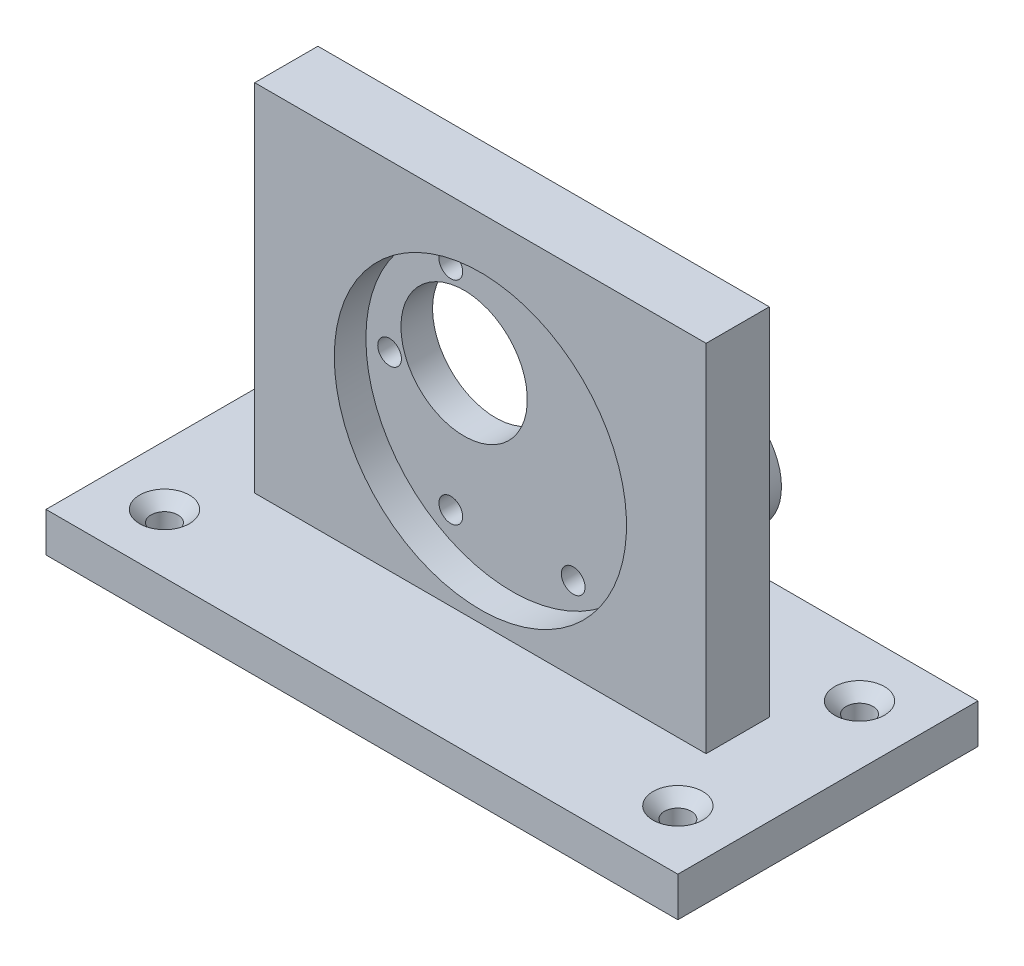
ISO-10303-21;
HEADER;
FILE_DESCRIPTION(('STEP AP214'),'2;1');
FILE_NAME('part.step','',(''),(''),'','','');
FILE_SCHEMA(('AUTOMOTIVE_DESIGN { 1 0 10303 214 1 1 1 1 }'));
ENDSEC;
DATA;
#1=APPLICATION_CONTEXT('core data for automotive mechanical design processes');
#2=APPLICATION_PROTOCOL_DEFINITION('international standard','automotive_design',2000,#1);
#3=PRODUCT_CONTEXT('',#1,'mechanical');
#4=PRODUCT('Part','Part','',(#3));
#5=PRODUCT_RELATED_PRODUCT_CATEGORY('part','',(#4));
#6=PRODUCT_DEFINITION_FORMATION('','',#4);
#7=PRODUCT_DEFINITION_CONTEXT('part definition',#1,'design');
#8=PRODUCT_DEFINITION('design','',#6,#7);
#9=PRODUCT_DEFINITION_SHAPE('','',#8);
#10=(LENGTH_UNIT() NAMED_UNIT(*) SI_UNIT(.MILLI.,.METRE.));
#11=(NAMED_UNIT(*) PLANE_ANGLE_UNIT() SI_UNIT($,.RADIAN.));
#12=(NAMED_UNIT(*) SI_UNIT($,.STERADIAN.) SOLID_ANGLE_UNIT());
#13=UNCERTAINTY_MEASURE_WITH_UNIT(LENGTH_MEASURE(1.E-05),#10,'distance_accuracy_value','');
#14=(GEOMETRIC_REPRESENTATION_CONTEXT(3) GLOBAL_UNCERTAINTY_ASSIGNED_CONTEXT((#13)) GLOBAL_UNIT_ASSIGNED_CONTEXT((#10,
#11,#12)) REPRESENTATION_CONTEXT('',''));
#15=CARTESIAN_POINT('',(0.,0.,0.));
#16=DIRECTION('',(0.,0.,1.));
#17=DIRECTION('',(1.,0.,0.));
#18=AXIS2_PLACEMENT_3D('',#15,#16,#17);
#19=CARTESIAN_POINT('',(40.,5.,23.));
#20=DIRECTION('',(0.,-1.,0.));
#21=DIRECTION('',(-1.,0.,0.));
#22=AXIS2_PLACEMENT_3D('',#19,#20,#21);
#23=PLANE('',#22);
#24=CARTESIAN_POINT('',(32.5,5.,-7.5));
#25=DIRECTION('',(0.,-1.,0.));
#26=DIRECTION('',(0.,0.,1.));
#27=AXIS2_PLACEMENT_3D('',#24,#25,#26);
#28=CIRCLE('',#27,3.15);
#29=CARTESIAN_POINT('',(32.5,5.,-4.35));
#30=VERTEX_POINT('',#29);
#31=EDGE_CURVE('E150',#30,#30,#28,.T.);
#32=ORIENTED_EDGE('',*,*,#31,.T.);
#33=EDGE_LOOP('',(#32));
#34=FACE_BOUND('',#33,.T.);
#35=CARTESIAN_POINT('',(-32.5,5.00000000000002,15.5));
#36=DIRECTION('',(0.,-1.,0.));
#37=DIRECTION('',(0.,0.,1.));
#38=AXIS2_PLACEMENT_3D('',#35,#36,#37);
#39=CIRCLE('',#38,3.15);
#40=CARTESIAN_POINT('',(-32.5,5.00000000000002,18.65));
#41=VERTEX_POINT('',#40);
#42=EDGE_CURVE('E160',#41,#41,#39,.T.);
#43=ORIENTED_EDGE('',*,*,#42,.T.);
#44=EDGE_LOOP('',(#43));
#45=FACE_BOUND('',#44,.T.);
#46=CARTESIAN_POINT('',(-32.5,5.00000000000002,-7.5));
#47=DIRECTION('',(0.,-1.,0.));
#48=DIRECTION('',(0.,0.,1.));
#49=AXIS2_PLACEMENT_3D('',#46,#47,#48);
#50=CIRCLE('',#49,3.15);
#51=CARTESIAN_POINT('',(-32.5,5.00000000000002,-4.35));
#52=VERTEX_POINT('',#51);
#53=EDGE_CURVE('E172',#52,#52,#50,.T.);
#54=ORIENTED_EDGE('',*,*,#53,.T.);
#55=EDGE_LOOP('',(#54));
#56=FACE_BOUND('',#55,.T.);
#57=DIRECTION('',(0.,0.,-1.));
#58=VECTOR('',#57,1.);
#59=CARTESIAN_POINT('',(-40.,5.00000000000002,23.));
#60=LINE('',#59,#58);
#61=CARTESIAN_POINT('',(-40.,5.00000000000002,23.));
#62=VERTEX_POINT('',#61);
#63=CARTESIAN_POINT('',(-40.,5.00000000000002,-15.));
#64=VERTEX_POINT('',#63);
#65=EDGE_CURVE('E216',#62,#64,#60,.T.);
#66=ORIENTED_EDGE('',*,*,#65,.F.);
#67=DIRECTION('',(1.,0.,0.));
#68=VECTOR('',#67,1.);
#69=CARTESIAN_POINT('',(40.,5.,23.));
#70=LINE('',#69,#68);
#71=CARTESIAN_POINT('',(40.,5.,23.));
#72=VERTEX_POINT('',#71);
#73=EDGE_CURVE('E208',#62,#72,#70,.T.);
#74=ORIENTED_EDGE('',*,*,#73,.T.);
#75=DIRECTION('',(0.,0.,-1.));
#76=VECTOR('',#75,1.);
#77=CARTESIAN_POINT('',(40.,5.,23.));
#78=LINE('',#77,#76);
#79=CARTESIAN_POINT('',(40.,5.,-15.));
#80=VERTEX_POINT('',#79);
#81=EDGE_CURVE('E212',#72,#80,#78,.T.);
#82=ORIENTED_EDGE('',*,*,#81,.T.);
#83=DIRECTION('',(1.,0.,0.));
#84=VECTOR('',#83,1.);
#85=CARTESIAN_POINT('',(40.,5.,-15.));
#86=LINE('',#85,#84);
#87=EDGE_CURVE('E194',#64,#80,#86,.T.);
#88=ORIENTED_EDGE('',*,*,#87,.F.);
#89=EDGE_LOOP('',(#66,#74,#82,#88));
#90=FACE_BOUND('',#89,.T.);
#91=DIRECTION('',(0.,0.,-1.));
#92=VECTOR('',#91,1.);
#93=CARTESIAN_POINT('',(-28.575,5.00000000000001,8.));
#94=LINE('',#93,#92);
#95=CARTESIAN_POINT('',(-28.575,5.00000000000001,8.));
#96=VERTEX_POINT('',#95);
#97=CARTESIAN_POINT('',(-28.575,5.00000000000001,0.));
#98=VERTEX_POINT('',#97);
#99=EDGE_CURVE('E228',#96,#98,#94,.T.);
#100=ORIENTED_EDGE('',*,*,#99,.T.);
#101=DIRECTION('',(1.,0.,0.));
#102=VECTOR('',#101,1.);
#103=CARTESIAN_POINT('',(0.,5.00000000000001,0.));
#104=LINE('',#103,#102);
#105=CARTESIAN_POINT('',(28.575,5.,0.));
#106=VERTEX_POINT('',#105);
#107=EDGE_CURVE('E54',#98,#106,#104,.T.);
#108=ORIENTED_EDGE('',*,*,#107,.T.);
#109=DIRECTION('',(0.,0.,-1.));
#110=VECTOR('',#109,1.);
#111=CARTESIAN_POINT('',(28.575,5.,8.));
#112=LINE('',#111,#110);
#113=CARTESIAN_POINT('',(28.575,5.,8.));
#114=VERTEX_POINT('',#113);
#115=EDGE_CURVE('E232',#114,#106,#112,.T.);
#116=ORIENTED_EDGE('',*,*,#115,.F.);
#117=DIRECTION('',(1.,0.,0.));
#118=VECTOR('',#117,1.);
#119=CARTESIAN_POINT('',(0.,5.00000000000001,8.));
#120=LINE('',#119,#118);
#121=EDGE_CURVE('E236',#96,#114,#120,.T.);
#122=ORIENTED_EDGE('',*,*,#121,.F.);
#123=EDGE_LOOP('',(#100,#108,#116,#122));
#124=FACE_BOUND('',#123,.T.);
#125=CARTESIAN_POINT('',(32.5,5.,15.5));
#126=DIRECTION('',(0.,-1.,0.));
#127=DIRECTION('',(0.,0.,1.));
#128=AXIS2_PLACEMENT_3D('',#125,#126,#127);
#129=CIRCLE('',#128,3.15);
#130=CARTESIAN_POINT('',(32.5,5.,18.65));
#131=VERTEX_POINT('',#130);
#132=EDGE_CURVE('E141',#131,#131,#129,.T.);
#133=ORIENTED_EDGE('',*,*,#132,.T.);
#134=EDGE_LOOP('',(#133));
#135=FACE_BOUND('',#134,.T.);
#136=ADVANCED_FACE('F45',(#34,#45,#56,#90,#124,#135),#23,.F.);
#137=CARTESIAN_POINT('',(28.575,50.,8.));
#138=DIRECTION('',(-1.,0.,0.));
#139=DIRECTION('',(0.,1.,0.));
#140=AXIS2_PLACEMENT_3D('',#137,#138,#139);
#141=PLANE('',#140);
#142=ORIENTED_EDGE('',*,*,#115,.T.);
#143=DIRECTION('',(0.,-1.,0.));
#144=VECTOR('',#143,1.);
#145=CARTESIAN_POINT('',(28.575,50.,0.));
#146=LINE('',#145,#144);
#147=CARTESIAN_POINT('',(28.575,50.,0.));
#148=VERTEX_POINT('',#147);
#149=EDGE_CURVE('E298',#148,#106,#146,.T.);
#150=ORIENTED_EDGE('',*,*,#149,.F.);
#151=DIRECTION('',(0.,0.,-1.));
#152=VECTOR('',#151,1.);
#153=CARTESIAN_POINT('',(28.575,50.,8.));
#154=LINE('',#153,#152);
#155=CARTESIAN_POINT('',(28.575,50.,8.));
#156=VERTEX_POINT('',#155);
#157=EDGE_CURVE('E312',#156,#148,#154,.T.);
#158=ORIENTED_EDGE('',*,*,#157,.F.);
#159=DIRECTION('',(0.,-1.,0.));
#160=VECTOR('',#159,1.);
#161=CARTESIAN_POINT('',(28.575,50.,8.));
#162=LINE('',#161,#160);
#163=EDGE_CURVE('E301',#156,#114,#162,.T.);
#164=ORIENTED_EDGE('',*,*,#163,.T.);
#165=EDGE_LOOP('',(#142,#150,#158,#164));
#166=FACE_BOUND('',#165,.T.);
#167=ADVANCED_FACE('F335',(#166),#141,.F.);
#168=CARTESIAN_POINT('',(-28.575,50.,8.));
#169=DIRECTION('',(-1.,0.,0.));
#170=DIRECTION('',(0.,1.,0.));
#171=AXIS2_PLACEMENT_3D('',#168,#169,#170);
#172=PLANE('',#171);
#173=DIRECTION('',(0.,-1.,0.));
#174=VECTOR('',#173,1.);
#175=CARTESIAN_POINT('',(-28.575,50.,8.));
#176=LINE('',#175,#174);
#177=CARTESIAN_POINT('',(-28.575,50.,8.));
#178=VERTEX_POINT('',#177);
#179=EDGE_CURVE('E297',#178,#96,#176,.T.);
#180=ORIENTED_EDGE('',*,*,#179,.F.);
#181=DIRECTION('',(0.,0.,-1.));
#182=VECTOR('',#181,1.);
#183=CARTESIAN_POINT('',(-28.575,50.,8.));
#184=LINE('',#183,#182);
#185=CARTESIAN_POINT('',(-28.575,50.,0.));
#186=VERTEX_POINT('',#185);
#187=EDGE_CURVE('E304',#178,#186,#184,.T.);
#188=ORIENTED_EDGE('',*,*,#187,.T.);
#189=DIRECTION('',(0.,-1.,0.));
#190=VECTOR('',#189,1.);
#191=CARTESIAN_POINT('',(-28.575,50.,0.));
#192=LINE('',#191,#190);
#193=EDGE_CURVE('E307',#186,#98,#192,.T.);
#194=ORIENTED_EDGE('',*,*,#193,.T.);
#195=ORIENTED_EDGE('',*,*,#99,.F.);
#196=EDGE_LOOP('',(#180,#188,#194,#195));
#197=FACE_BOUND('',#196,.T.);
#198=ADVANCED_FACE('F341',(#197),#172,.T.);
#199=CARTESIAN_POINT('',(0.,0.,8.));
#200=DIRECTION('',(0.,0.,-1.));
#201=DIRECTION('',(1.,0.,0.));
#202=AXIS2_PLACEMENT_3D('',#199,#200,#201);
#203=PLANE('',#202);
#204=CARTESIAN_POINT('',(0.,25.,8.));
#205=DIRECTION('',(0.,0.,-1.));
#206=DIRECTION('',(-1.,0.,0.));
#207=AXIS2_PLACEMENT_3D('',#204,#205,#206);
#208=CIRCLE('',#207,18.5);
#209=CARTESIAN_POINT('',(-18.5,25.,8.));
#210=VERTEX_POINT('',#209);
#211=EDGE_CURVE('E240',#210,#210,#208,.T.);
#212=ORIENTED_EDGE('',*,*,#211,.T.);
#213=EDGE_LOOP('',(#212));
#214=FACE_BOUND('',#213,.T.);
#215=ORIENTED_EDGE('',*,*,#121,.T.);
#216=ORIENTED_EDGE('',*,*,#163,.F.);
#217=DIRECTION('',(-1.,0.,0.));
#218=VECTOR('',#217,1.);
#219=CARTESIAN_POINT('',(28.575,50.,8.));
#220=LINE('',#219,#218);
#221=EDGE_CURVE('E294',#156,#178,#220,.T.);
#222=ORIENTED_EDGE('',*,*,#221,.T.);
#223=ORIENTED_EDGE('',*,*,#179,.T.);
#224=EDGE_LOOP('',(#215,#216,#222,#223));
#225=FACE_BOUND('',#224,.T.);
#226=ADVANCED_FACE('F338',(#214,#225),#203,.F.);
#227=CARTESIAN_POINT('',(0.,0.,0.));
#228=DIRECTION('',(0.,0.,-1.));
#229=DIRECTION('',(1.,0.,0.));
#230=AXIS2_PLACEMENT_3D('',#227,#228,#229);
#231=PLANE('',#230);
#232=CARTESIAN_POINT('',(20.3378221746704,28.4999999993294,0.));
#233=DIRECTION('',(0.,0.,1.));
#234=DIRECTION('',(1.,0.,0.));
#235=AXIS2_PLACEMENT_3D('',#232,#233,#234);
#236=CIRCLE('',#235,7.239);
#237=CARTESIAN_POINT('',(27.5768221746704,28.4999999993294,0.));
#238=VERTEX_POINT('',#237);
#239=EDGE_CURVE('E737',#238,#238,#236,.T.);
#240=ORIENTED_EDGE('',*,*,#239,.T.);
#241=EDGE_LOOP('',(#240));
#242=FACE_BOUND('',#241,.T.);
#243=CARTESIAN_POINT('',(7.74999999999999,38.4233937586588,0.));
#244=DIRECTION('',(0.,0.,-1.));
#245=DIRECTION('',(-1.,0.,0.));
#246=AXIS2_PLACEMENT_3D('',#243,#244,#245);
#247=CIRCLE('',#246,1.50000000039213);
#248=CARTESIAN_POINT('',(6.24999999960786,38.4233937586588,0.));
#249=VERTEX_POINT('',#248);
#250=EDGE_CURVE('E274',#249,#249,#247,.T.);
#251=ORIENTED_EDGE('',*,*,#250,.F.);
#252=EDGE_LOOP('',(#251));
#253=FACE_BOUND('',#252,.T.);
#254=CARTESIAN_POINT('',(7.74999999999999,11.5766062413412,0.));
#255=DIRECTION('',(0.,0.,-1.));
#256=DIRECTION('',(-1.,0.,0.));
#257=AXIS2_PLACEMENT_3D('',#254,#255,#256);
#258=CIRCLE('',#257,1.50000000039213);
#259=CARTESIAN_POINT('',(6.24999999960786,11.5766062413412,0.));
#260=VERTEX_POINT('',#259);
#261=EDGE_CURVE('E279',#260,#260,#258,.T.);
#262=ORIENTED_EDGE('',*,*,#261,.F.);
#263=EDGE_LOOP('',(#262));
#264=FACE_BOUND('',#263,.T.);
#265=CARTESIAN_POINT('',(-7.75000000000001,11.5766062413412,0.));
#266=DIRECTION('',(0.,0.,-1.));
#267=DIRECTION('',(-1.,0.,0.));
#268=AXIS2_PLACEMENT_3D('',#265,#266,#267);
#269=CIRCLE('',#268,1.50000000039213);
#270=CARTESIAN_POINT('',(-9.25000000039214,11.5766062413412,0.));
#271=VERTEX_POINT('',#270);
#272=EDGE_CURVE('E283',#271,#271,#269,.T.);
#273=ORIENTED_EDGE('',*,*,#272,.F.);
#274=EDGE_LOOP('',(#273));
#275=FACE_BOUND('',#274,.T.);
#276=CARTESIAN_POINT('',(-15.5,25.,0.));
#277=DIRECTION('',(0.,0.,-1.));
#278=DIRECTION('',(-1.,0.,0.));
#279=AXIS2_PLACEMENT_3D('',#276,#277,#278);
#280=CIRCLE('',#279,1.50000000039213);
#281=CARTESIAN_POINT('',(-17.0000000003921,25.,0.));
#282=VERTEX_POINT('',#281);
#283=EDGE_CURVE('E273',#282,#282,#280,.T.);
#284=ORIENTED_EDGE('',*,*,#283,.F.);
#285=EDGE_LOOP('',(#284));
#286=FACE_BOUND('',#285,.T.);
#287=CARTESIAN_POINT('',(-6.06217782532956,28.4999999993294,0.));
#288=DIRECTION('',(0.,0.,-1.));
#289=DIRECTION('',(-1.,0.,0.));
#290=AXIS2_PLACEMENT_3D('',#287,#288,#289);
#291=CIRCLE('',#290,8.00000000000001);
#292=CARTESIAN_POINT('',(-14.0621778253296,28.4999999993294,0.));
#293=VERTEX_POINT('',#292);
#294=EDGE_CURVE('E269',#293,#293,#291,.T.);
#295=ORIENTED_EDGE('',*,*,#294,.F.);
#296=EDGE_LOOP('',(#295));
#297=FACE_BOUND('',#296,.T.);
#298=CARTESIAN_POINT('',(-7.74999999999999,38.4233937586588,0.));
#299=DIRECTION('',(0.,0.,-1.));
#300=DIRECTION('',(-1.,0.,0.));
#301=AXIS2_PLACEMENT_3D('',#298,#299,#300);
#302=CIRCLE('',#301,1.50000000039214);
#303=CARTESIAN_POINT('',(-9.25000000039213,38.4233937586588,0.));
#304=VERTEX_POINT('',#303);
#305=EDGE_CURVE('E278',#304,#304,#302,.T.);
#306=ORIENTED_EDGE('',*,*,#305,.F.);
#307=EDGE_LOOP('',(#306));
#308=FACE_BOUND('',#307,.T.);
#309=ORIENTED_EDGE('',*,*,#193,.F.);
#310=DIRECTION('',(-1.,0.,0.));
#311=VECTOR('',#310,1.);
#312=CARTESIAN_POINT('',(28.575,50.,0.));
#313=LINE('',#312,#311);
#314=EDGE_CURVE('E293',#148,#186,#313,.T.);
#315=ORIENTED_EDGE('',*,*,#314,.F.);
#316=ORIENTED_EDGE('',*,*,#149,.T.);
#317=ORIENTED_EDGE('',*,*,#107,.F.);
#318=EDGE_LOOP('',(#309,#315,#316,#317));
#319=FACE_BOUND('',#318,.T.);
#320=ADVANCED_FACE('F331',(#242,#253,#264,#275,#286,#297,#308,#319),#231,.T.);
#321=CARTESIAN_POINT('',(-7.74999999999999,38.4233937586588,10.));
#322=DIRECTION('',(0.,0.,-1.));
#323=DIRECTION('',(1.,0.,0.));
#324=AXIS2_PLACEMENT_3D('',#321,#322,#323);
#325=CYLINDRICAL_SURFACE('',#324,1.50000000039214);
#326=ORIENTED_EDGE('',*,*,#305,.T.);
#327=EDGE_LOOP('',(#326));
#328=FACE_BOUND('',#327,.T.);
#329=CARTESIAN_POINT('',(-7.74999999999999,38.4233937586588,4.));
#330=DIRECTION('',(0.,0.,-1.));
#331=DIRECTION('',(-1.,0.,0.));
#332=AXIS2_PLACEMENT_3D('',#329,#330,#331);
#333=CIRCLE('',#332,1.50000000039214);
#334=CARTESIAN_POINT('',(-9.25000000039213,38.4233937586588,4.));
#335=VERTEX_POINT('',#334);
#336=EDGE_CURVE('E265',#335,#335,#333,.T.);
#337=ORIENTED_EDGE('',*,*,#336,.F.);
#338=EDGE_LOOP('',(#337));
#339=FACE_BOUND('',#338,.T.);
#340=ADVANCED_FACE('F384',(#328,#339),#325,.F.);
#341=CARTESIAN_POINT('',(-6.06217782532956,28.4999999993294,10.));
#342=DIRECTION('',(0.,0.,-1.));
#343=DIRECTION('',(1.,0.,0.));
#344=AXIS2_PLACEMENT_3D('',#341,#342,#343);
#345=CYLINDRICAL_SURFACE('',#344,8.00000000000001);
#346=ORIENTED_EDGE('',*,*,#294,.T.);
#347=EDGE_LOOP('',(#346));
#348=FACE_BOUND('',#347,.T.);
#349=CARTESIAN_POINT('',(-6.06217782532956,28.4999999993294,4.));
#350=DIRECTION('',(0.,0.,-1.));
#351=DIRECTION('',(-1.,0.,0.));
#352=AXIS2_PLACEMENT_3D('',#349,#350,#351);
#353=CIRCLE('',#352,8.00000000000001);
#354=CARTESIAN_POINT('',(-14.0621778253296,28.4999999993294,4.));
#355=VERTEX_POINT('',#354);
#356=EDGE_CURVE('E261',#355,#355,#353,.T.);
#357=ORIENTED_EDGE('',*,*,#356,.F.);
#358=EDGE_LOOP('',(#357));
#359=FACE_BOUND('',#358,.T.);
#360=ADVANCED_FACE('F381',(#348,#359),#345,.F.);
#361=CARTESIAN_POINT('',(-15.5,25.,10.));
#362=DIRECTION('',(0.,0.,-1.));
#363=DIRECTION('',(1.,0.,0.));
#364=AXIS2_PLACEMENT_3D('',#361,#362,#363);
#365=CYLINDRICAL_SURFACE('',#364,1.50000000039213);
#366=ORIENTED_EDGE('',*,*,#283,.T.);
#367=EDGE_LOOP('',(#366));
#368=FACE_BOUND('',#367,.T.);
#369=CARTESIAN_POINT('',(-15.5,25.,4.));
#370=DIRECTION('',(0.,0.,-1.));
#371=DIRECTION('',(-1.,0.,0.));
#372=AXIS2_PLACEMENT_3D('',#369,#370,#371);
#373=CIRCLE('',#372,1.50000000039213);
#374=CARTESIAN_POINT('',(-17.0000000003921,25.,4.));
#375=VERTEX_POINT('',#374);
#376=EDGE_CURVE('E257',#375,#375,#373,.T.);
#377=ORIENTED_EDGE('',*,*,#376,.F.);
#378=EDGE_LOOP('',(#377));
#379=FACE_BOUND('',#378,.T.);
#380=ADVANCED_FACE('F383',(#368,#379),#365,.F.);
#381=CARTESIAN_POINT('',(-7.75000000000001,11.5766062413412,10.));
#382=DIRECTION('',(0.,0.,-1.));
#383=DIRECTION('',(1.,0.,0.));
#384=AXIS2_PLACEMENT_3D('',#381,#382,#383);
#385=CYLINDRICAL_SURFACE('',#384,1.50000000039213);
#386=ORIENTED_EDGE('',*,*,#272,.T.);
#387=EDGE_LOOP('',(#386));
#388=FACE_BOUND('',#387,.T.);
#389=CARTESIAN_POINT('',(-7.75000000000001,11.5766062413412,4.));
#390=DIRECTION('',(0.,0.,-1.));
#391=DIRECTION('',(-1.,0.,0.));
#392=AXIS2_PLACEMENT_3D('',#389,#390,#391);
#393=CIRCLE('',#392,1.50000000039213);
#394=CARTESIAN_POINT('',(-9.25000000039214,11.5766062413412,4.));
#395=VERTEX_POINT('',#394);
#396=EDGE_CURVE('E253',#395,#395,#393,.T.);
#397=ORIENTED_EDGE('',*,*,#396,.F.);
#398=EDGE_LOOP('',(#397));
#399=FACE_BOUND('',#398,.T.);
#400=ADVANCED_FACE('F389',(#388,#399),#385,.F.);
#401=CARTESIAN_POINT('',(7.74999999999999,11.5766062413412,10.));
#402=DIRECTION('',(0.,0.,-1.));
#403=DIRECTION('',(1.,0.,0.));
#404=AXIS2_PLACEMENT_3D('',#401,#402,#403);
#405=CYLINDRICAL_SURFACE('',#404,1.50000000039213);
#406=ORIENTED_EDGE('',*,*,#261,.T.);
#407=EDGE_LOOP('',(#406));
#408=FACE_BOUND('',#407,.T.);
#409=CARTESIAN_POINT('',(7.74999999999999,11.5766062413412,4.));
#410=DIRECTION('',(0.,0.,-1.));
#411=DIRECTION('',(-1.,0.,0.));
#412=AXIS2_PLACEMENT_3D('',#409,#410,#411);
#413=CIRCLE('',#412,1.50000000039213);
#414=CARTESIAN_POINT('',(6.24999999960786,11.5766062413412,4.));
#415=VERTEX_POINT('',#414);
#416=EDGE_CURVE('E249',#415,#415,#413,.T.);
#417=ORIENTED_EDGE('',*,*,#416,.F.);
#418=EDGE_LOOP('',(#417));
#419=FACE_BOUND('',#418,.T.);
#420=ADVANCED_FACE('F354',(#408,#419),#405,.F.);
#421=CARTESIAN_POINT('',(7.74999999999999,38.4233937586588,10.));
#422=DIRECTION('',(0.,0.,-1.));
#423=DIRECTION('',(1.,0.,0.));
#424=AXIS2_PLACEMENT_3D('',#421,#422,#423);
#425=CYLINDRICAL_SURFACE('',#424,1.50000000039213);
#426=ORIENTED_EDGE('',*,*,#250,.T.);
#427=EDGE_LOOP('',(#426));
#428=FACE_BOUND('',#427,.T.);
#429=CARTESIAN_POINT('',(7.74999999999999,38.4233937586588,4.));
#430=DIRECTION('',(0.,0.,-1.));
#431=DIRECTION('',(-1.,0.,0.));
#432=AXIS2_PLACEMENT_3D('',#429,#430,#431);
#433=CIRCLE('',#432,1.50000000039213);
#434=CARTESIAN_POINT('',(6.24999999960786,38.4233937586588,4.));
#435=VERTEX_POINT('',#434);
#436=EDGE_CURVE('E245',#435,#435,#433,.T.);
#437=ORIENTED_EDGE('',*,*,#436,.F.);
#438=EDGE_LOOP('',(#437));
#439=FACE_BOUND('',#438,.T.);
#440=ADVANCED_FACE('F346',(#428,#439),#425,.F.);
#441=CARTESIAN_POINT('',(28.575,50.,8.));
#442=DIRECTION('',(0.,1.,0.));
#443=DIRECTION('',(1.,0.,0.));
#444=AXIS2_PLACEMENT_3D('',#441,#442,#443);
#445=PLANE('',#444);
#446=ORIENTED_EDGE('',*,*,#314,.T.);
#447=ORIENTED_EDGE('',*,*,#187,.F.);
#448=ORIENTED_EDGE('',*,*,#221,.F.);
#449=ORIENTED_EDGE('',*,*,#157,.T.);
#450=EDGE_LOOP('',(#446,#447,#448,#449));
#451=FACE_BOUND('',#450,.T.);
#452=ADVANCED_FACE('F47',(#451),#445,.T.);
#453=CARTESIAN_POINT('',(0.,25.,4.));
#454=DIRECTION('',(0.,0.,1.));
#455=DIRECTION('',(-1.,0.,0.));
#456=AXIS2_PLACEMENT_3D('',#453,#454,#455);
#457=CYLINDRICAL_SURFACE('',#456,18.5);
#458=CARTESIAN_POINT('',(0.,25.,4.));
#459=DIRECTION('',(0.,0.,-1.));
#460=DIRECTION('',(-1.,0.,0.));
#461=AXIS2_PLACEMENT_3D('',#458,#459,#460);
#462=CIRCLE('',#461,18.5);
#463=CARTESIAN_POINT('',(-18.5,25.,4.));
#464=VERTEX_POINT('',#463);
#465=EDGE_CURVE('E241',#464,#464,#462,.T.);
#466=ORIENTED_EDGE('',*,*,#465,.T.);
#467=EDGE_LOOP('',(#466));
#468=FACE_BOUND('',#467,.T.);
#469=ORIENTED_EDGE('',*,*,#211,.F.);
#470=EDGE_LOOP('',(#469));
#471=FACE_BOUND('',#470,.T.);
#472=ADVANCED_FACE('F345',(#468,#471),#457,.F.);
#473=CARTESIAN_POINT('',(0.,25.,4.));
#474=DIRECTION('',(0.,0.,1.));
#475=DIRECTION('',(-1.,0.,0.));
#476=AXIS2_PLACEMENT_3D('',#473,#474,#475);
#477=PLANE('',#476);
#478=ORIENTED_EDGE('',*,*,#336,.T.);
#479=EDGE_LOOP('',(#478));
#480=FACE_BOUND('',#479,.T.);
#481=ORIENTED_EDGE('',*,*,#356,.T.);
#482=EDGE_LOOP('',(#481));
#483=FACE_BOUND('',#482,.T.);
#484=ORIENTED_EDGE('',*,*,#376,.T.);
#485=EDGE_LOOP('',(#484));
#486=FACE_BOUND('',#485,.T.);
#487=ORIENTED_EDGE('',*,*,#396,.T.);
#488=EDGE_LOOP('',(#487));
#489=FACE_BOUND('',#488,.T.);
#490=ORIENTED_EDGE('',*,*,#416,.T.);
#491=EDGE_LOOP('',(#490));
#492=FACE_BOUND('',#491,.T.);
#493=ORIENTED_EDGE('',*,*,#436,.T.);
#494=EDGE_LOOP('',(#493));
#495=FACE_BOUND('',#494,.T.);
#496=ORIENTED_EDGE('',*,*,#465,.F.);
#497=EDGE_LOOP('',(#496));
#498=FACE_BOUND('',#497,.T.);
#499=ADVANCED_FACE('F351',(#480,#483,#486,#489,#492,#495,#498),#477,.T.);
#500=CARTESIAN_POINT('',(40.,5.,23.));
#501=DIRECTION('',(-1.,0.,0.));
#502=DIRECTION('',(0.,0.,-1.));
#503=AXIS2_PLACEMENT_3D('',#500,#501,#502);
#504=PLANE('',#503);
#505=ORIENTED_EDGE('',*,*,#81,.F.);
#506=DIRECTION('',(0.,-1.,0.));
#507=VECTOR('',#506,1.);
#508=CARTESIAN_POINT('',(40.,5.,23.));
#509=LINE('',#508,#507);
#510=CARTESIAN_POINT('',(40.,0.,23.));
#511=VERTEX_POINT('',#510);
#512=EDGE_CURVE('E198',#72,#511,#509,.T.);
#513=ORIENTED_EDGE('',*,*,#512,.T.);
#514=DIRECTION('',(0.,0.,-1.));
#515=VECTOR('',#514,1.);
#516=CARTESIAN_POINT('',(40.,0.,23.));
#517=LINE('',#516,#515);
#518=CARTESIAN_POINT('',(40.,0.,-15.));
#519=VERTEX_POINT('',#518);
#520=EDGE_CURVE('E224',#511,#519,#517,.T.);
#521=ORIENTED_EDGE('',*,*,#520,.T.);
#522=DIRECTION('',(0.,-1.,0.));
#523=VECTOR('',#522,1.);
#524=CARTESIAN_POINT('',(40.,5.,-15.));
#525=LINE('',#524,#523);
#526=EDGE_CURVE('E184',#80,#519,#525,.T.);
#527=ORIENTED_EDGE('',*,*,#526,.F.);
#528=EDGE_LOOP('',(#505,#513,#521,#527));
#529=FACE_BOUND('',#528,.T.);
#530=ADVANCED_FACE('F373',(#529),#504,.F.);
#531=CARTESIAN_POINT('',(-40.,5.00000000000002,23.));
#532=DIRECTION('',(1.,0.,0.));
#533=DIRECTION('',(0.,0.,1.));
#534=AXIS2_PLACEMENT_3D('',#531,#532,#533);
#535=PLANE('',#534);
#536=DIRECTION('',(0.,0.,-1.));
#537=VECTOR('',#536,1.);
#538=CARTESIAN_POINT('',(-40.,0.,23.));
#539=LINE('',#538,#537);
#540=CARTESIAN_POINT('',(-40.,0.,23.));
#541=VERTEX_POINT('',#540);
#542=CARTESIAN_POINT('',(-40.,0.,-15.));
#543=VERTEX_POINT('',#542);
#544=EDGE_CURVE('E220',#541,#543,#539,.T.);
#545=ORIENTED_EDGE('',*,*,#544,.F.);
#546=DIRECTION('',(0.,1.,0.));
#547=VECTOR('',#546,1.);
#548=CARTESIAN_POINT('',(-40.,5.00000000000002,23.));
#549=LINE('',#548,#547);
#550=EDGE_CURVE('E205',#541,#62,#549,.T.);
#551=ORIENTED_EDGE('',*,*,#550,.T.);
#552=ORIENTED_EDGE('',*,*,#65,.T.);
#553=DIRECTION('',(0.,1.,0.));
#554=VECTOR('',#553,1.);
#555=CARTESIAN_POINT('',(-40.,5.00000000000002,-15.));
#556=LINE('',#555,#554);
#557=EDGE_CURVE('E191',#543,#64,#556,.T.);
#558=ORIENTED_EDGE('',*,*,#557,.F.);
#559=EDGE_LOOP('',(#545,#551,#552,#558));
#560=FACE_BOUND('',#559,.T.);
#561=ADVANCED_FACE('F370',(#560),#535,.F.);
#562=CARTESIAN_POINT('',(0.,0.,23.));
#563=DIRECTION('',(0.,0.,1.));
#564=DIRECTION('',(-1.,0.,0.));
#565=AXIS2_PLACEMENT_3D('',#562,#563,#564);
#566=PLANE('',#565);
#567=ORIENTED_EDGE('',*,*,#512,.F.);
#568=ORIENTED_EDGE('',*,*,#73,.F.);
#569=ORIENTED_EDGE('',*,*,#550,.F.);
#570=DIRECTION('',(-1.,0.,0.));
#571=VECTOR('',#570,1.);
#572=CARTESIAN_POINT('',(40.,0.,23.));
#573=LINE('',#572,#571);
#574=EDGE_CURVE('E202',#511,#541,#573,.T.);
#575=ORIENTED_EDGE('',*,*,#574,.F.);
#576=EDGE_LOOP('',(#567,#568,#569,#575));
#577=FACE_BOUND('',#576,.T.);
#578=ADVANCED_FACE('F368',(#577),#566,.T.);
#579=CARTESIAN_POINT('',(0.,0.,-15.));
#580=DIRECTION('',(0.,0.,1.));
#581=DIRECTION('',(-1.,0.,0.));
#582=AXIS2_PLACEMENT_3D('',#579,#580,#581);
#583=PLANE('',#582);
#584=ORIENTED_EDGE('',*,*,#526,.T.);
#585=DIRECTION('',(-1.,0.,0.));
#586=VECTOR('',#585,1.);
#587=CARTESIAN_POINT('',(40.,0.,-15.));
#588=LINE('',#587,#586);
#589=EDGE_CURVE('E188',#519,#543,#588,.T.);
#590=ORIENTED_EDGE('',*,*,#589,.T.);
#591=ORIENTED_EDGE('',*,*,#557,.T.);
#592=ORIENTED_EDGE('',*,*,#87,.T.);
#593=EDGE_LOOP('',(#584,#590,#591,#592));
#594=FACE_BOUND('',#593,.T.);
#595=ADVANCED_FACE('F408',(#594),#583,.F.);
#596=CARTESIAN_POINT('',(28.575,0.,8.));
#597=DIRECTION('',(0.,1.,0.));
#598=DIRECTION('',(1.,0.,0.));
#599=AXIS2_PLACEMENT_3D('',#596,#597,#598);
#600=PLANE('',#599);
#601=CARTESIAN_POINT('',(32.5,0.,-7.5));
#602=DIRECTION('',(0.,-1.,0.));
#603=DIRECTION('',(0.,0.,1.));
#604=AXIS2_PLACEMENT_3D('',#601,#602,#603);
#605=CIRCLE('',#604,1.69999999999999);
#606=CARTESIAN_POINT('',(32.9036495479958,0.,-5.8486166276716));
#607=VERTEX_POINT('',#606);
#608=CARTESIAN_POINT('',(32.9870959921775,0.,-9.12872265730069));
#609=VERTEX_POINT('',#608);
#610=EDGE_CURVE('E133',#607,#609,#605,.T.);
#611=ORIENTED_EDGE('',*,*,#610,.F.);
#612=CARTESIAN_POINT('',(33.3910360725576,0.,-7.47733189377985));
#613=DIRECTION('',(0.,-1.,0.));
#614=DIRECTION('',(-0.999676555950965,0.,-0.0254319382276978));
#615=AXIS2_PLACEMENT_3D('',#612,#613,#614);
#616=ELLIPSE('',#615,1.70110897002667,1.69999999999995);
#617=EDGE_CURVE('E125',#609,#607,#616,.T.);
#618=ORIENTED_EDGE('',*,*,#617,.F.);
#619=EDGE_LOOP('',(#611,#618));
#620=FACE_BOUND('',#619,.T.);
#621=CARTESIAN_POINT('',(32.5,0.,15.5));
#622=DIRECTION('',(0.,-1.,0.));
#623=DIRECTION('',(0.,0.,1.));
#624=AXIS2_PLACEMENT_3D('',#621,#622,#623);
#625=CIRCLE('',#624,1.69999999999999);
#626=CARTESIAN_POINT('',(32.3175387253942,0.,17.1901798375526));
#627=VERTEX_POINT('',#626);
#628=CARTESIAN_POINT('',(32.4037160435226,0.,13.8027288373024));
#629=VERTEX_POINT('',#628);
#630=EDGE_CURVE('E157',#627,#629,#625,.T.);
#631=ORIENTED_EDGE('',*,*,#630,.F.);
#632=EDGE_CURVE('E60',#629,#627,#625,.T.);
#633=ORIENTED_EDGE('',*,*,#632,.F.);
#634=EDGE_LOOP('',(#631,#633));
#635=FACE_BOUND('',#634,.T.);
#636=CARTESIAN_POINT('',(-32.5,0.,15.5));
#637=DIRECTION('',(0.,-1.,0.));
#638=DIRECTION('',(0.,0.,1.));
#639=AXIS2_PLACEMENT_3D('',#636,#637,#638);
#640=CIRCLE('',#639,1.69999999999999);
#641=CARTESIAN_POINT('',(-32.5,0.,17.2));
#642=VERTEX_POINT('',#641);
#643=EDGE_CURVE('E168',#642,#642,#640,.T.);
#644=ORIENTED_EDGE('',*,*,#643,.F.);
#645=EDGE_LOOP('',(#644));
#646=FACE_BOUND('',#645,.T.);
#647=CARTESIAN_POINT('',(-32.5,0.,-7.5));
#648=DIRECTION('',(0.,-1.,0.));
#649=DIRECTION('',(0.,0.,1.));
#650=AXIS2_PLACEMENT_3D('',#647,#648,#649);
#651=CIRCLE('',#650,1.69999999999999);
#652=CARTESIAN_POINT('',(-32.5,0.,-5.80000000000001));
#653=VERTEX_POINT('',#652);
#654=EDGE_CURVE('E180',#653,#653,#651,.T.);
#655=ORIENTED_EDGE('',*,*,#654,.F.);
#656=EDGE_LOOP('',(#655));
#657=FACE_BOUND('',#656,.T.);
#658=ORIENTED_EDGE('',*,*,#520,.F.);
#659=ORIENTED_EDGE('',*,*,#574,.T.);
#660=ORIENTED_EDGE('',*,*,#544,.T.);
#661=ORIENTED_EDGE('',*,*,#589,.F.);
#662=EDGE_LOOP('',(#658,#659,#660,#661));
#663=FACE_BOUND('',#662,.T.);
#664=ADVANCED_FACE('F139',(#620,#635,#646,#657,#663),#600,.F.);
#665=CARTESIAN_POINT('',(-32.5,5.00000000000001,-7.5));
#666=DIRECTION('',(0.,1.,0.));
#667=DIRECTION('',(0.,0.,1.));
#668=AXIS2_PLACEMENT_3D('',#665,#666,#667);
#669=CYLINDRICAL_SURFACE('',#668,1.69999999999999);
#670=ORIENTED_EDGE('',*,*,#654,.T.);
#671=EDGE_LOOP('',(#670));
#672=FACE_BOUND('',#671,.T.);
#673=CARTESIAN_POINT('',(-32.5,3.55000000000001,-7.5));
#674=DIRECTION('',(0.,-1.,0.));
#675=DIRECTION('',(0.,0.,1.));
#676=AXIS2_PLACEMENT_3D('',#673,#674,#675);
#677=CIRCLE('',#676,1.69999999999999);
#678=CARTESIAN_POINT('',(-32.5,3.55000000000001,-5.80000000000001));
#679=VERTEX_POINT('',#678);
#680=EDGE_CURVE('E176',#679,#679,#677,.T.);
#681=ORIENTED_EDGE('',*,*,#680,.F.);
#682=EDGE_LOOP('',(#681));
#683=FACE_BOUND('',#682,.T.);
#684=ADVANCED_FACE('F407',(#672,#683),#669,.F.);
#685=CARTESIAN_POINT('',(-32.5,5.00000000000002,-7.5));
#686=DIRECTION('',(0.,1.,0.));
#687=DIRECTION('',(0.,0.,1.));
#688=AXIS2_PLACEMENT_3D('',#685,#686,#687);
#689=CONICAL_SURFACE('',#688,3.15,0.78539816339745);
#690=ORIENTED_EDGE('',*,*,#680,.T.);
#691=EDGE_LOOP('',(#690));
#692=FACE_BOUND('',#691,.T.);
#693=ORIENTED_EDGE('',*,*,#53,.F.);
#694=EDGE_LOOP('',(#693));
#695=FACE_BOUND('',#694,.T.);
#696=ADVANCED_FACE('F514',(#692,#695),#689,.F.);
#697=CARTESIAN_POINT('',(-32.5,5.00000000000001,15.5));
#698=DIRECTION('',(0.,1.,0.));
#699=DIRECTION('',(0.,0.,1.));
#700=AXIS2_PLACEMENT_3D('',#697,#698,#699);
#701=CYLINDRICAL_SURFACE('',#700,1.69999999999999);
#702=ORIENTED_EDGE('',*,*,#643,.T.);
#703=EDGE_LOOP('',(#702));
#704=FACE_BOUND('',#703,.T.);
#705=CARTESIAN_POINT('',(-32.5,3.55000000000001,15.5));
#706=DIRECTION('',(0.,-1.,0.));
#707=DIRECTION('',(0.,0.,1.));
#708=AXIS2_PLACEMENT_3D('',#705,#706,#707);
#709=CIRCLE('',#708,1.69999999999999);
#710=CARTESIAN_POINT('',(-32.5,3.55000000000001,17.2));
#711=VERTEX_POINT('',#710);
#712=EDGE_CURVE('E164',#711,#711,#709,.T.);
#713=ORIENTED_EDGE('',*,*,#712,.F.);
#714=EDGE_LOOP('',(#713));
#715=FACE_BOUND('',#714,.T.);
#716=ADVANCED_FACE('F525',(#704,#715),#701,.F.);
#717=CARTESIAN_POINT('',(-32.5,5.00000000000002,15.5));
#718=DIRECTION('',(0.,1.,0.));
#719=DIRECTION('',(0.,0.,1.));
#720=AXIS2_PLACEMENT_3D('',#717,#718,#719);
#721=CONICAL_SURFACE('',#720,3.15,0.78539816339745);
#722=ORIENTED_EDGE('',*,*,#712,.T.);
#723=EDGE_LOOP('',(#722));
#724=FACE_BOUND('',#723,.T.);
#725=ORIENTED_EDGE('',*,*,#42,.F.);
#726=EDGE_LOOP('',(#725));
#727=FACE_BOUND('',#726,.T.);
#728=ADVANCED_FACE('F536',(#724,#727),#721,.F.);
#729=CARTESIAN_POINT('',(32.5,5.,15.5));
#730=DIRECTION('',(0.,1.,0.));
#731=DIRECTION('',(0.,0.,1.));
#732=AXIS2_PLACEMENT_3D('',#729,#730,#731);
#733=CYLINDRICAL_SURFACE('',#732,1.69999999999999);
#734=ORIENTED_EDGE('',*,*,#630,.T.);
#735=ORIENTED_EDGE('',*,*,#632,.T.);
#736=EDGE_LOOP('',(#734,#735));
#737=FACE_BOUND('',#736,.T.);
#738=CARTESIAN_POINT('',(32.5,3.54999999999999,15.5));
#739=DIRECTION('',(0.,-1.,0.));
#740=DIRECTION('',(0.,0.,1.));
#741=AXIS2_PLACEMENT_3D('',#738,#739,#740);
#742=CIRCLE('',#741,1.69999999999999);
#743=CARTESIAN_POINT('',(32.5,3.54999999999999,17.2));
#744=VERTEX_POINT('',#743);
#745=EDGE_CURVE('E147',#744,#744,#742,.T.);
#746=ORIENTED_EDGE('',*,*,#745,.F.);
#747=EDGE_LOOP('',(#746));
#748=FACE_BOUND('',#747,.T.);
#749=ADVANCED_FACE('F547',(#737,#748),#733,.F.);
#750=CARTESIAN_POINT('',(32.5,5.,15.5));
#751=DIRECTION('',(0.,1.,0.));
#752=DIRECTION('',(0.,0.,1.));
#753=AXIS2_PLACEMENT_3D('',#750,#751,#752);
#754=CONICAL_SURFACE('',#753,3.15,0.78539816339745);
#755=ORIENTED_EDGE('',*,*,#745,.T.);
#756=EDGE_LOOP('',(#755));
#757=FACE_BOUND('',#756,.T.);
#758=ORIENTED_EDGE('',*,*,#132,.F.);
#759=EDGE_LOOP('',(#758));
#760=FACE_BOUND('',#759,.T.);
#761=ADVANCED_FACE('F558',(#757,#760),#754,.F.);
#762=CARTESIAN_POINT('',(32.5,5.,-7.5));
#763=DIRECTION('',(0.,1.,0.));
#764=DIRECTION('',(0.,0.,1.));
#765=AXIS2_PLACEMENT_3D('',#762,#763,#764);
#766=CYLINDRICAL_SURFACE('',#765,1.69999999999999);
#767=ORIENTED_EDGE('',*,*,#610,.T.);
#768=CARTESIAN_POINT('',(32.5,-0.016094793527521,-7.5));
#769=DIRECTION('',(0.0360908865319122,-0.999348089954104,0.000918158169658495));
#770=DIRECTION('',(0.999024856761494,0.036102563691293,0.0254153588916807));
#771=AXIS2_PLACEMENT_3D('',#768,#769,#770);
#772=ELLIPSE('',#771,1.70110897002671,1.69999999999999);
#773=EDGE_CURVE('E11',#607,#609,#772,.F.);
#774=ORIENTED_EDGE('',*,*,#773,.F.);
#775=EDGE_LOOP('',(#767,#774));
#776=FACE_BOUND('',#775,.T.);
#777=CARTESIAN_POINT('',(32.5,3.54999999999999,-7.5));
#778=DIRECTION('',(0.,-1.,0.));
#779=DIRECTION('',(0.,0.,1.));
#780=AXIS2_PLACEMENT_3D('',#777,#778,#779);
#781=CIRCLE('',#780,1.69999999999999);
#782=CARTESIAN_POINT('',(32.5,3.54999999999999,-5.80000000000001));
#783=VERTEX_POINT('',#782);
#784=EDGE_CURVE('E142',#783,#783,#781,.T.);
#785=ORIENTED_EDGE('',*,*,#784,.F.);
#786=EDGE_LOOP('',(#785));
#787=FACE_BOUND('',#786,.T.);
#788=ADVANCED_FACE('F130',(#776,#787),#766,.F.);
#789=CARTESIAN_POINT('',(32.5,5.,-7.5));
#790=DIRECTION('',(0.,1.,0.));
#791=DIRECTION('',(0.,0.,1.));
#792=AXIS2_PLACEMENT_3D('',#789,#790,#791);
#793=CONICAL_SURFACE('',#792,3.15,0.78539816339745);
#794=ORIENTED_EDGE('',*,*,#784,.T.);
#795=EDGE_LOOP('',(#794));
#796=FACE_BOUND('',#795,.T.);
#797=ORIENTED_EDGE('',*,*,#31,.F.);
#798=EDGE_LOOP('',(#797));
#799=FACE_BOUND('',#798,.T.);
#800=ADVANCED_FACE('F578',(#796,#799),#793,.F.);
#801=CARTESIAN_POINT('',(20.3378221746704,28.4999999993294,-2.54));
#802=DIRECTION('',(0.,0.,-1.));
#803=DIRECTION('',(1.,0.,0.));
#804=AXIS2_PLACEMENT_3D('',#801,#802,#803);
#805=PLANE('',#804);
#806=CARTESIAN_POINT('',(20.3378221746704,28.4999999993294,-2.54));
#807=DIRECTION('',(0.,0.,1.));
#808=DIRECTION('',(1.,0.,0.));
#809=AXIS2_PLACEMENT_3D('',#806,#807,#808);
#810=CIRCLE('',#809,7.239);
#811=CARTESIAN_POINT('',(27.5768221746704,28.4999999993294,-2.54));
#812=VERTEX_POINT('',#811);
#813=EDGE_CURVE('E738',#812,#812,#810,.T.);
#814=ORIENTED_EDGE('',*,*,#813,.F.);
#815=EDGE_LOOP('',(#814));
#816=FACE_BOUND('',#815,.T.);
#817=CARTESIAN_POINT('',(20.3378221746704,28.4999999993294,-2.54));
#818=DIRECTION('',(0.,0.,1.));
#819=DIRECTION('',(1.,0.,0.));
#820=AXIS2_PLACEMENT_3D('',#817,#818,#819);
#821=CIRCLE('',#820,5.334);
#822=CARTESIAN_POINT('',(25.6718221746704,28.4999999993294,-2.54));
#823=VERTEX_POINT('',#822);
#824=EDGE_CURVE('E137',#823,#823,#821,.T.);
#825=ORIENTED_EDGE('',*,*,#824,.T.);
#826=EDGE_LOOP('',(#825));
#827=FACE_BOUND('',#826,.T.);
#828=ADVANCED_FACE('F588',(#816,#827),#805,.T.);
#829=CARTESIAN_POINT('',(20.3378221746704,28.4999999993294,-2.54));
#830=DIRECTION('',(0.,0.,1.));
#831=DIRECTION('',(-1.,0.,0.));
#832=AXIS2_PLACEMENT_3D('',#829,#830,#831);
#833=CYLINDRICAL_SURFACE('',#832,7.239);
#834=ORIENTED_EDGE('',*,*,#813,.T.);
#835=EDGE_LOOP('',(#834));
#836=FACE_BOUND('',#835,.T.);
#837=ORIENTED_EDGE('',*,*,#239,.F.);
#838=EDGE_LOOP('',(#837));
#839=FACE_BOUND('',#838,.T.);
#840=ADVANCED_FACE('F599',(#836,#839),#833,.T.);
#841=CARTESIAN_POINT('',(20.3378221746704,28.4999999993294,-2.54));
#842=DIRECTION('',(0.,0.,1.));
#843=DIRECTION('',(-1.,0.,0.));
#844=AXIS2_PLACEMENT_3D('',#841,#842,#843);
#845=CYLINDRICAL_SURFACE('',#844,5.334);
#846=ORIENTED_EDGE('',*,*,#824,.F.);
#847=EDGE_LOOP('',(#846));
#848=FACE_BOUND('',#847,.T.);
#849=CARTESIAN_POINT('',(20.3378221746704,28.4999999993294,3.175));
#850=DIRECTION('',(0.,0.,1.));
#851=DIRECTION('',(1.,0.,0.));
#852=AXIS2_PLACEMENT_3D('',#849,#850,#851);
#853=CIRCLE('',#852,5.334);
#854=CARTESIAN_POINT('',(25.6718221746704,28.4999999993294,3.175));
#855=VERTEX_POINT('',#854);
#856=EDGE_CURVE('E126',#855,#855,#853,.T.);
#857=ORIENTED_EDGE('',*,*,#856,.T.);
#858=EDGE_LOOP('',(#857));
#859=FACE_BOUND('',#858,.T.);
#860=ADVANCED_FACE('F610',(#848,#859),#845,.F.);
#861=CARTESIAN_POINT('',(33.7483746119551,-9.89461942138965,-7.46824114176988));
#862=DIRECTION('',(-0.0360908865319122,0.999348089954104,-0.000918158169658495));
#863=DIRECTION('',(0.999348511186798,0.0360909017444907,0.));
#864=AXIS2_PLACEMENT_3D('',#861,#862,#863);
#865=CYLINDRICAL_SURFACE('',#864,1.69999999999995);
#866=CARTESIAN_POINT('',(33.3904551971907,0.0160843011699149,-7.47734667134602));
#867=DIRECTION('',(0.0360908865319122,-0.999348089954104,0.000918158169658495));
#868=DIRECTION('',(0.999348511186798,0.0360909017444907,0.));
#869=AXIS2_PLACEMENT_3D('',#866,#867,#868);
#870=CIRCLE('',#869,1.69999999999995);
#871=EDGE_CURVE('E118',#609,#607,#870,.T.);
#872=ORIENTED_EDGE('',*,*,#871,.F.);
#873=ORIENTED_EDGE('',*,*,#617,.T.);
#874=EDGE_LOOP('',(#872,#873));
#875=FACE_BOUND('',#874,.T.);
#876=ADVANCED_FACE('F134',(#875),#865,.F.);
#877=CARTESIAN_POINT('',(33.3904551971907,0.0160843011699149,-7.47734667134602));
#878=DIRECTION('',(-0.0360908865319122,0.999348089954104,-0.000918158169658495));
#879=DIRECTION('',(0.999348511186798,0.0360909017444907,0.));
#880=AXIS2_PLACEMENT_3D('',#877,#878,#879);
#881=PLANE('',#880);
#882=ORIENTED_EDGE('',*,*,#871,.T.);
#883=ORIENTED_EDGE('',*,*,#773,.T.);
#884=EDGE_LOOP('',(#882,#883));
#885=FACE_BOUND('',#884,.T.);
#886=ADVANCED_FACE('F120',(#885),#881,.F.);
#887=CARTESIAN_POINT('',(0.,0.,3.175));
#888=DIRECTION('',(0.,0.,-1.));
#889=DIRECTION('',(1.,0.,0.));
#890=AXIS2_PLACEMENT_3D('',#887,#888,#889);
#891=PLANE('',#890);
#892=ORIENTED_EDGE('',*,*,#856,.F.);
#893=EDGE_LOOP('',(#892));
#894=FACE_BOUND('',#893,.T.);
#895=ADVANCED_FACE('F640',(#894),#891,.T.);
#896=CLOSED_SHELL('',(#136,#167,#198,#226,#320,#340,#360,#380,#400,#420,#440,#452,#472,#499,
#530,#561,#578,#595,#664,#684,#696,#716,#728,#749,#761,#788,#800,#828,#840,#860,#876,#886,#895));
#897=MANIFOLD_SOLID_BREP('B2',#896);
#898=ADVANCED_BREP_SHAPE_REPRESENTATION('',(#18,#897),#14);
#899=SHAPE_DEFINITION_REPRESENTATION(#9,#898);
ENDSEC;
END-ISO-10303-21;
